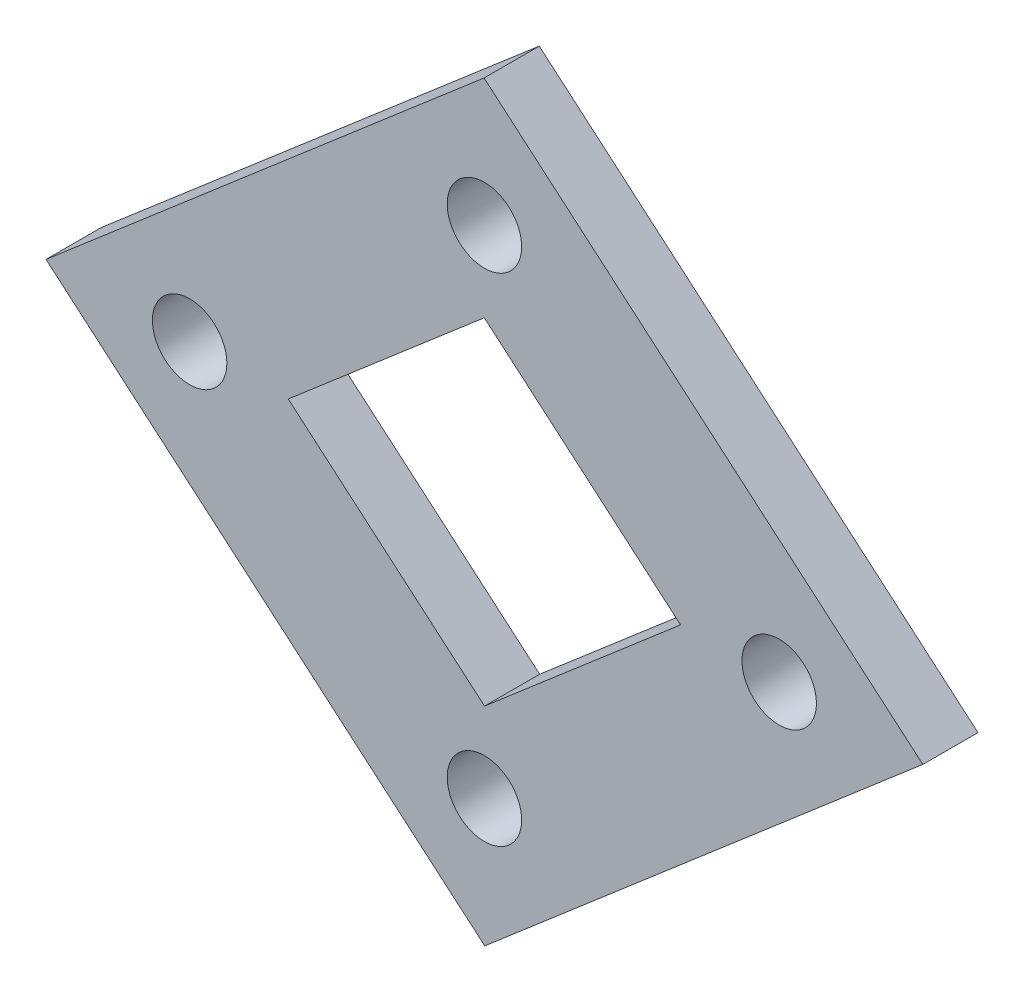
ISO-10303-21;
HEADER;
FILE_DESCRIPTION(('STEP AP214'),'2;1');
FILE_NAME('part.step','',(''),(''),'','','');
FILE_SCHEMA(('AUTOMOTIVE_DESIGN { 1 0 10303 214 1 1 1 1 }'));
ENDSEC;
DATA;
#1=APPLICATION_CONTEXT('core data for automotive mechanical design processes');
#2=APPLICATION_PROTOCOL_DEFINITION('international standard','automotive_design',2000,#1);
#3=PRODUCT_CONTEXT('',#1,'mechanical');
#4=PRODUCT('Part','Part','',(#3));
#5=PRODUCT_RELATED_PRODUCT_CATEGORY('part','',(#4));
#6=PRODUCT_DEFINITION_FORMATION('','',#4);
#7=PRODUCT_DEFINITION_CONTEXT('part definition',#1,'design');
#8=PRODUCT_DEFINITION('design','',#6,#7);
#9=PRODUCT_DEFINITION_SHAPE('','',#8);
#10=(LENGTH_UNIT() NAMED_UNIT(*) SI_UNIT(.MILLI.,.METRE.));
#11=(NAMED_UNIT(*) PLANE_ANGLE_UNIT() SI_UNIT($,.RADIAN.));
#12=(NAMED_UNIT(*) SI_UNIT($,.STERADIAN.) SOLID_ANGLE_UNIT());
#13=UNCERTAINTY_MEASURE_WITH_UNIT(LENGTH_MEASURE(1.E-05),#10,'distance_accuracy_value','');
#14=(GEOMETRIC_REPRESENTATION_CONTEXT(3) GLOBAL_UNCERTAINTY_ASSIGNED_CONTEXT((#13)) GLOBAL_UNIT_ASSIGNED_CONTEXT((#10,
#11,#12)) REPRESENTATION_CONTEXT('',''));
#15=CARTESIAN_POINT('',(0.,0.,0.));
#16=DIRECTION('',(0.,0.,1.));
#17=DIRECTION('',(1.,0.,0.));
#18=AXIS2_PLACEMENT_3D('',#15,#16,#17);
#19=CARTESIAN_POINT('',(-0.010881059290546,12.106513675807,1.778));
#20=DIRECTION('',(0.,0.,-1.));
#21=DIRECTION('',(-1.,0.,0.));
#22=AXIS2_PLACEMENT_3D('',#19,#20,#21);
#23=PLANE('',#22);
#24=DIRECTION('',(-0.758671381510446,-0.651473510495271,0.));
#25=VECTOR('',#24,1.);
#26=CARTESIAN_POINT('',(-0.0037231314855661,5.41674400301342,1.778));
#27=LINE('',#26,#25);
#28=CARTESIAN_POINT('',(-0.00372313148556654,5.41674400301342,1.778));
#29=VERTEX_POINT('',#28);
#30=CARTESIAN_POINT('',(-6.32172027620627,-0.00854009163069231,1.778));
#31=VERTEX_POINT('',#30);
#32=EDGE_CURVE('E117',#29,#31,#27,.T.);
#33=ORIENTED_EDGE('',*,*,#32,.F.);
#34=DIRECTION('',(-0.760063771593147,0.649848492428504,0.));
#35=VECTOR('',#34,1.);
#36=CARTESIAN_POINT('',(6.32172027620628,0.0085400916306967,1.778));
#37=LINE('',#36,#35);
#38=CARTESIAN_POINT('',(6.32172027620628,0.0085400916306967,1.778));
#39=VERTEX_POINT('',#38);
#40=EDGE_CURVE('E48',#39,#29,#37,.T.);
#41=ORIENTED_EDGE('',*,*,#40,.F.);
#42=DIRECTION('',(0.758671381510446,0.651473510495271,0.));
#43=VECTOR('',#42,1.);
#44=CARTESIAN_POINT('',(0.00372313148557427,-5.41674400301341,1.778));
#45=LINE('',#44,#43);
#46=CARTESIAN_POINT('',(0.00372313148557427,-5.41674400301341,1.778));
#47=VERTEX_POINT('',#46);
#48=EDGE_CURVE('E110',#47,#39,#45,.T.);
#49=ORIENTED_EDGE('',*,*,#48,.F.);
#50=DIRECTION('',(0.760063771593147,-0.649848492428504,0.));
#51=VECTOR('',#50,1.);
#52=CARTESIAN_POINT('',(-6.32172027620627,-0.00854009163069231,1.778));
#53=LINE('',#52,#51);
#54=EDGE_CURVE('E124',#31,#47,#53,.T.);
#55=ORIENTED_EDGE('',*,*,#54,.F.);
#56=EDGE_LOOP('',(#33,#41,#49,#55));
#57=FACE_BOUND('',#56,.T.);
#58=CARTESIAN_POINT('',(0.,-7.99999999999999,1.778));
#59=DIRECTION('',(0.,0.,1.));
#60=DIRECTION('',(1.,0.,0.));
#61=AXIS2_PLACEMENT_3D('',#58,#59,#60);
#62=CIRCLE('',#61,1.2);
#63=CARTESIAN_POINT('',(1.19999999999994,-7.99999999999999,1.778));
#64=VERTEX_POINT('',#63);
#65=EDGE_CURVE('E139',#64,#64,#62,.T.);
#66=ORIENTED_EDGE('',*,*,#65,.F.);
#67=EDGE_LOOP('',(#66));
#68=FACE_BOUND('',#67,.T.);
#69=CARTESIAN_POINT('',(0.,7.99999999999999,1.778));
#70=DIRECTION('',(0.,0.,1.));
#71=DIRECTION('',(1.,0.,0.));
#72=AXIS2_PLACEMENT_3D('',#69,#70,#71);
#73=CIRCLE('',#72,1.2);
#74=CARTESIAN_POINT('',(1.2,7.99999999999999,1.778));
#75=VERTEX_POINT('',#74);
#76=EDGE_CURVE('E151',#75,#75,#73,.T.);
#77=ORIENTED_EDGE('',*,*,#76,.F.);
#78=EDGE_LOOP('',(#77));
#79=FACE_BOUND('',#78,.T.);
#80=DIRECTION('',(-0.758671381510446,-0.651473510495271,0.));
#81=VECTOR('',#80,1.);
#82=CARTESIAN_POINT('',(-14.1291563645924,-0.0168939014920275,1.778));
#83=LINE('',#82,#81);
#84=CARTESIAN_POINT('',(-0.0108810592905463,12.106513675807,1.778));
#85=VERTEX_POINT('',#84);
#86=CARTESIAN_POINT('',(-14.1291563645924,-0.0168939014920275,1.778));
#87=VERTEX_POINT('',#86);
#88=EDGE_CURVE('E157',#85,#87,#83,.T.);
#89=ORIENTED_EDGE('',*,*,#88,.T.);
#90=DIRECTION('',(0.760063771593148,-0.649848492428504,0.));
#91=VECTOR('',#90,1.);
#92=CARTESIAN_POINT('',(-14.1291563645924,-0.0168939014920275,1.778));
#93=LINE('',#92,#91);
#94=CARTESIAN_POINT('',(0.0108810592905524,-12.106513675807,1.778));
#95=VERTEX_POINT('',#94);
#96=EDGE_CURVE('E160',#87,#95,#93,.T.);
#97=ORIENTED_EDGE('',*,*,#96,.T.);
#98=DIRECTION('',(0.758671381510446,0.651473510495271,0.));
#99=VECTOR('',#98,1.);
#100=CARTESIAN_POINT('',(0.0108810592905524,-12.106513675807,1.778));
#101=LINE('',#100,#99);
#102=CARTESIAN_POINT('',(14.1291563645924,0.0168939014920327,1.778));
#103=VERTEX_POINT('',#102);
#104=EDGE_CURVE('E163',#95,#103,#101,.T.);
#105=ORIENTED_EDGE('',*,*,#104,.T.);
#106=DIRECTION('',(-0.760063771593148,0.649848492428504,0.));
#107=VECTOR('',#106,1.);
#108=CARTESIAN_POINT('',(-0.0108810592905463,12.106513675807,1.778));
#109=LINE('',#108,#107);
#110=EDGE_CURVE('E165',#103,#85,#109,.T.);
#111=ORIENTED_EDGE('',*,*,#110,.T.);
#112=EDGE_LOOP('',(#89,#97,#105,#111));
#113=FACE_BOUND('',#112,.T.);
#114=CARTESIAN_POINT('',(-9.5,0.,1.778));
#115=DIRECTION('',(0.,0.,1.));
#116=DIRECTION('',(1.,0.,0.));
#117=AXIS2_PLACEMENT_3D('',#114,#115,#116);
#118=CIRCLE('',#117,1.2);
#119=CARTESIAN_POINT('',(-8.3,0.,1.778));
#120=VERTEX_POINT('',#119);
#121=EDGE_CURVE('E145',#120,#120,#118,.T.);
#122=ORIENTED_EDGE('',*,*,#121,.F.);
#123=EDGE_LOOP('',(#122));
#124=FACE_BOUND('',#123,.T.);
#125=CARTESIAN_POINT('',(9.5,0.,1.778));
#126=DIRECTION('',(0.,0.,1.));
#127=DIRECTION('',(1.,0.,0.));
#128=AXIS2_PLACEMENT_3D('',#125,#126,#127);
#129=CIRCLE('',#128,1.2);
#130=CARTESIAN_POINT('',(10.7,0.,1.778));
#131=VERTEX_POINT('',#130);
#132=EDGE_CURVE('E133',#131,#131,#129,.T.);
#133=ORIENTED_EDGE('',*,*,#132,.F.);
#134=EDGE_LOOP('',(#133));
#135=FACE_BOUND('',#134,.T.);
#136=ADVANCED_FACE('F33',(#57,#68,#79,#113,#124,#135),#23,.F.);
#137=CARTESIAN_POINT('',(-0.010881059290546,12.106513675807,0.));
#138=DIRECTION('',(0.,0.,-1.));
#139=DIRECTION('',(-1.,0.,0.));
#140=AXIS2_PLACEMENT_3D('',#137,#138,#139);
#141=PLANE('',#140);
#142=DIRECTION('',(-0.760063771593148,0.649848492428504,0.));
#143=VECTOR('',#142,1.);
#144=CARTESIAN_POINT('',(6.32172027620628,0.0085400916306967,0.));
#145=LINE('',#144,#143);
#146=CARTESIAN_POINT('',(6.32172027620628,0.00854009163069654,0.));
#147=VERTEX_POINT('',#146);
#148=CARTESIAN_POINT('',(-0.0037231314855661,5.41674400301342,0.));
#149=VERTEX_POINT('',#148);
#150=EDGE_CURVE('E108',#147,#149,#145,.T.);
#151=ORIENTED_EDGE('',*,*,#150,.T.);
#152=DIRECTION('',(-0.758671381510446,-0.651473510495271,0.));
#153=VECTOR('',#152,1.);
#154=CARTESIAN_POINT('',(-0.0037231314855661,5.41674400301342,0.));
#155=LINE('',#154,#153);
#156=CARTESIAN_POINT('',(-6.32172027620627,-0.00854009163069394,0.));
#157=VERTEX_POINT('',#156);
#158=EDGE_CURVE('E97',#149,#157,#155,.T.);
#159=ORIENTED_EDGE('',*,*,#158,.T.);
#160=DIRECTION('',(0.760063771593147,-0.649848492428504,0.));
#161=VECTOR('',#160,1.);
#162=CARTESIAN_POINT('',(-6.32172027620627,-0.00854009163069231,0.));
#163=LINE('',#162,#161);
#164=CARTESIAN_POINT('',(0.00372313148557478,-5.41674400301341,0.));
#165=VERTEX_POINT('',#164);
#166=EDGE_CURVE('E119',#157,#165,#163,.T.);
#167=ORIENTED_EDGE('',*,*,#166,.T.);
#168=DIRECTION('',(0.758671381510446,0.651473510495271,0.));
#169=VECTOR('',#168,1.);
#170=CARTESIAN_POINT('',(0.00372313148557427,-5.41674400301341,0.));
#171=LINE('',#170,#169);
#172=EDGE_CURVE('E115',#165,#147,#171,.T.);
#173=ORIENTED_EDGE('',*,*,#172,.T.);
#174=EDGE_LOOP('',(#151,#159,#167,#173));
#175=FACE_BOUND('',#174,.T.);
#176=CARTESIAN_POINT('',(0.,-7.99999999999999,0.));
#177=DIRECTION('',(0.,0.,1.));
#178=DIRECTION('',(1.,0.,0.));
#179=AXIS2_PLACEMENT_3D('',#176,#177,#178);
#180=CIRCLE('',#179,1.2);
#181=CARTESIAN_POINT('',(1.19999999999994,-7.99999999999999,0.));
#182=VERTEX_POINT('',#181);
#183=EDGE_CURVE('E136',#182,#182,#180,.T.);
#184=ORIENTED_EDGE('',*,*,#183,.T.);
#185=EDGE_LOOP('',(#184));
#186=FACE_BOUND('',#185,.T.);
#187=CARTESIAN_POINT('',(0.,7.99999999999999,0.));
#188=DIRECTION('',(0.,0.,1.));
#189=DIRECTION('',(1.,0.,0.));
#190=AXIS2_PLACEMENT_3D('',#187,#188,#189);
#191=CIRCLE('',#190,1.2);
#192=CARTESIAN_POINT('',(1.2,7.99999999999999,0.));
#193=VERTEX_POINT('',#192);
#194=EDGE_CURVE('E148',#193,#193,#191,.T.);
#195=ORIENTED_EDGE('',*,*,#194,.T.);
#196=EDGE_LOOP('',(#195));
#197=FACE_BOUND('',#196,.T.);
#198=DIRECTION('',(-0.758671381510446,-0.651473510495271,0.));
#199=VECTOR('',#198,1.);
#200=CARTESIAN_POINT('',(-14.1291563645924,-0.0168939014920275,0.));
#201=LINE('',#200,#199);
#202=CARTESIAN_POINT('',(-0.0108810592905463,12.106513675807,0.));
#203=VERTEX_POINT('',#202);
#204=CARTESIAN_POINT('',(-14.1291563645924,-0.0168939014920275,0.));
#205=VERTEX_POINT('',#204);
#206=EDGE_CURVE('E154',#203,#205,#201,.T.);
#207=ORIENTED_EDGE('',*,*,#206,.F.);
#208=DIRECTION('',(-0.760063771593148,0.649848492428504,0.));
#209=VECTOR('',#208,1.);
#210=CARTESIAN_POINT('',(-0.0108810592905463,12.106513675807,0.));
#211=LINE('',#210,#209);
#212=CARTESIAN_POINT('',(14.1291563645924,0.0168939014920327,0.));
#213=VERTEX_POINT('',#212);
#214=EDGE_CURVE('E161',#213,#203,#211,.T.);
#215=ORIENTED_EDGE('',*,*,#214,.F.);
#216=DIRECTION('',(0.758671381510446,0.651473510495271,0.));
#217=VECTOR('',#216,1.);
#218=CARTESIAN_POINT('',(0.0108810592905524,-12.106513675807,0.));
#219=LINE('',#218,#217);
#220=CARTESIAN_POINT('',(0.0108810592905524,-12.106513675807,0.));
#221=VERTEX_POINT('',#220);
#222=EDGE_CURVE('E172',#221,#213,#219,.T.);
#223=ORIENTED_EDGE('',*,*,#222,.F.);
#224=DIRECTION('',(0.760063771593148,-0.649848492428504,0.));
#225=VECTOR('',#224,1.);
#226=CARTESIAN_POINT('',(-14.1291563645924,-0.0168939014920275,0.));
#227=LINE('',#226,#225);
#228=EDGE_CURVE('E170',#205,#221,#227,.T.);
#229=ORIENTED_EDGE('',*,*,#228,.F.);
#230=EDGE_LOOP('',(#207,#215,#223,#229));
#231=FACE_BOUND('',#230,.T.);
#232=CARTESIAN_POINT('',(-9.5,0.,0.));
#233=DIRECTION('',(0.,0.,1.));
#234=DIRECTION('',(1.,0.,0.));
#235=AXIS2_PLACEMENT_3D('',#232,#233,#234);
#236=CIRCLE('',#235,1.2);
#237=CARTESIAN_POINT('',(-8.3,0.,0.));
#238=VERTEX_POINT('',#237);
#239=EDGE_CURVE('E142',#238,#238,#236,.T.);
#240=ORIENTED_EDGE('',*,*,#239,.T.);
#241=EDGE_LOOP('',(#240));
#242=FACE_BOUND('',#241,.T.);
#243=CARTESIAN_POINT('',(9.5,0.,0.));
#244=DIRECTION('',(0.,0.,1.));
#245=DIRECTION('',(1.,0.,0.));
#246=AXIS2_PLACEMENT_3D('',#243,#244,#245);
#247=CIRCLE('',#246,1.2);
#248=CARTESIAN_POINT('',(10.7,0.,0.));
#249=VERTEX_POINT('',#248);
#250=EDGE_CURVE('E104',#249,#249,#247,.T.);
#251=ORIENTED_EDGE('',*,*,#250,.T.);
#252=EDGE_LOOP('',(#251));
#253=FACE_BOUND('',#252,.T.);
#254=ADVANCED_FACE('F113',(#175,#186,#197,#231,#242,#253),#141,.T.);
#255=CARTESIAN_POINT('',(-14.1291563645924,-0.0168939014920275,1.778));
#256=DIRECTION('',(0.651473510495271,-0.758671381510446,0.));
#257=DIRECTION('',(0.758671381510446,0.651473510495271,0.));
#258=AXIS2_PLACEMENT_3D('',#255,#256,#257);
#259=PLANE('',#258);
#260=ORIENTED_EDGE('',*,*,#206,.T.);
#261=DIRECTION('',(0.,0.,-1.));
#262=VECTOR('',#261,1.);
#263=CARTESIAN_POINT('',(-14.1291563645924,-0.0168939014920275,1.778));
#264=LINE('',#263,#262);
#265=EDGE_CURVE('E11',#87,#205,#264,.T.);
#266=ORIENTED_EDGE('',*,*,#265,.F.);
#267=ORIENTED_EDGE('',*,*,#88,.F.);
#268=DIRECTION('',(0.,0.,-1.));
#269=VECTOR('',#268,1.);
#270=CARTESIAN_POINT('',(-0.0108810592905463,12.106513675807,1.778));
#271=LINE('',#270,#269);
#272=EDGE_CURVE('E167',#85,#203,#271,.T.);
#273=ORIENTED_EDGE('',*,*,#272,.T.);
#274=EDGE_LOOP('',(#260,#266,#267,#273));
#275=FACE_BOUND('',#274,.T.);
#276=ADVANCED_FACE('F35',(#275),#259,.F.);
#277=CARTESIAN_POINT('',(-14.1291563645924,-0.0168939014920275,1.778));
#278=DIRECTION('',(0.649848492428504,0.760063771593148,0.));
#279=DIRECTION('',(-0.760063771593148,0.649848492428504,0.));
#280=AXIS2_PLACEMENT_3D('',#277,#278,#279);
#281=PLANE('',#280);
#282=ORIENTED_EDGE('',*,*,#228,.T.);
#283=DIRECTION('',(0.,0.,-1.));
#284=VECTOR('',#283,1.);
#285=CARTESIAN_POINT('',(0.0108810592905524,-12.106513675807,1.778));
#286=LINE('',#285,#284);
#287=EDGE_CURVE('E41',#95,#221,#286,.T.);
#288=ORIENTED_EDGE('',*,*,#287,.F.);
#289=ORIENTED_EDGE('',*,*,#96,.F.);
#290=ORIENTED_EDGE('',*,*,#265,.T.);
#291=EDGE_LOOP('',(#282,#288,#289,#290));
#292=FACE_BOUND('',#291,.T.);
#293=ADVANCED_FACE('F200',(#292),#281,.F.);
#294=CARTESIAN_POINT('',(0.0108810592905524,-12.106513675807,1.778));
#295=DIRECTION('',(-0.651473510495271,0.758671381510446,0.));
#296=DIRECTION('',(-0.758671381510446,-0.651473510495271,0.));
#297=AXIS2_PLACEMENT_3D('',#294,#295,#296);
#298=PLANE('',#297);
#299=ORIENTED_EDGE('',*,*,#222,.T.);
#300=DIRECTION('',(0.,0.,-1.));
#301=VECTOR('',#300,1.);
#302=CARTESIAN_POINT('',(14.1291563645924,0.0168939014920327,1.778));
#303=LINE('',#302,#301);
#304=EDGE_CURVE('E177',#103,#213,#303,.T.);
#305=ORIENTED_EDGE('',*,*,#304,.F.);
#306=ORIENTED_EDGE('',*,*,#104,.F.);
#307=ORIENTED_EDGE('',*,*,#287,.T.);
#308=EDGE_LOOP('',(#299,#305,#306,#307));
#309=FACE_BOUND('',#308,.T.);
#310=ADVANCED_FACE('F184',(#309),#298,.F.);
#311=CARTESIAN_POINT('',(-0.0108810592905463,12.106513675807,1.778));
#312=DIRECTION('',(-0.649848492428504,-0.760063771593148,0.));
#313=DIRECTION('',(0.760063771593148,-0.649848492428504,0.));
#314=AXIS2_PLACEMENT_3D('',#311,#312,#313);
#315=PLANE('',#314);
#316=ORIENTED_EDGE('',*,*,#214,.T.);
#317=ORIENTED_EDGE('',*,*,#272,.F.);
#318=ORIENTED_EDGE('',*,*,#110,.F.);
#319=ORIENTED_EDGE('',*,*,#304,.T.);
#320=EDGE_LOOP('',(#316,#317,#318,#319));
#321=FACE_BOUND('',#320,.T.);
#322=ADVANCED_FACE('F193',(#321),#315,.F.);
#323=CARTESIAN_POINT('',(0.,7.99999999999999,1.778));
#324=DIRECTION('',(0.,0.,-1.));
#325=DIRECTION('',(-1.,0.,0.));
#326=AXIS2_PLACEMENT_3D('',#323,#324,#325);
#327=CYLINDRICAL_SURFACE('',#326,1.2);
#328=ORIENTED_EDGE('',*,*,#76,.T.);
#329=EDGE_LOOP('',(#328));
#330=FACE_BOUND('',#329,.T.);
#331=ORIENTED_EDGE('',*,*,#194,.F.);
#332=EDGE_LOOP('',(#331));
#333=FACE_BOUND('',#332,.T.);
#334=ADVANCED_FACE('F216',(#330,#333),#327,.F.);
#335=CARTESIAN_POINT('',(-9.5,0.,1.778));
#336=DIRECTION('',(0.,0.,-1.));
#337=DIRECTION('',(-1.,0.,0.));
#338=AXIS2_PLACEMENT_3D('',#335,#336,#337);
#339=CYLINDRICAL_SURFACE('',#338,1.2);
#340=ORIENTED_EDGE('',*,*,#121,.T.);
#341=EDGE_LOOP('',(#340));
#342=FACE_BOUND('',#341,.T.);
#343=ORIENTED_EDGE('',*,*,#239,.F.);
#344=EDGE_LOOP('',(#343));
#345=FACE_BOUND('',#344,.T.);
#346=ADVANCED_FACE('F223',(#342,#345),#339,.F.);
#347=CARTESIAN_POINT('',(0.,-7.99999999999999,1.778));
#348=DIRECTION('',(0.,0.,-1.));
#349=DIRECTION('',(-1.,0.,0.));
#350=AXIS2_PLACEMENT_3D('',#347,#348,#349);
#351=CYLINDRICAL_SURFACE('',#350,1.2);
#352=ORIENTED_EDGE('',*,*,#65,.T.);
#353=EDGE_LOOP('',(#352));
#354=FACE_BOUND('',#353,.T.);
#355=ORIENTED_EDGE('',*,*,#183,.F.);
#356=EDGE_LOOP('',(#355));
#357=FACE_BOUND('',#356,.T.);
#358=ADVANCED_FACE('F228',(#354,#357),#351,.F.);
#359=CARTESIAN_POINT('',(9.5,0.,1.778));
#360=DIRECTION('',(0.,0.,-1.));
#361=DIRECTION('',(-1.,0.,0.));
#362=AXIS2_PLACEMENT_3D('',#359,#360,#361);
#363=CYLINDRICAL_SURFACE('',#362,1.2);
#364=ORIENTED_EDGE('',*,*,#132,.T.);
#365=EDGE_LOOP('',(#364));
#366=FACE_BOUND('',#365,.T.);
#367=ORIENTED_EDGE('',*,*,#250,.F.);
#368=EDGE_LOOP('',(#367));
#369=FACE_BOUND('',#368,.T.);
#370=ADVANCED_FACE('F238',(#366,#369),#363,.F.);
#371=CARTESIAN_POINT('',(6.32172027620628,0.0085400916306967,-0.000999999999999916));
#372=DIRECTION('',(0.649848492428504,0.760063771593147,0.));
#373=DIRECTION('',(-0.760063771593148,0.649848492428504,0.));
#374=AXIS2_PLACEMENT_3D('',#371,#372,#373);
#375=PLANE('',#374);
#376=DIRECTION('',(0.,0.,1.));
#377=VECTOR('',#376,1.);
#378=CARTESIAN_POINT('',(6.32172027620628,0.0085400916306967,-0.000999999999999916));
#379=LINE('',#378,#377);
#380=EDGE_CURVE('E105',#147,#39,#379,.T.);
#381=ORIENTED_EDGE('',*,*,#380,.T.);
#382=ORIENTED_EDGE('',*,*,#40,.T.);
#383=DIRECTION('',(0.,0.,1.));
#384=VECTOR('',#383,1.);
#385=CARTESIAN_POINT('',(-0.0037231314855661,5.41674400301342,-0.000999999999999916));
#386=LINE('',#385,#384);
#387=EDGE_CURVE('E99',#149,#29,#386,.T.);
#388=ORIENTED_EDGE('',*,*,#387,.F.);
#389=ORIENTED_EDGE('',*,*,#150,.F.);
#390=EDGE_LOOP('',(#381,#382,#388,#389));
#391=FACE_BOUND('',#390,.T.);
#392=ADVANCED_FACE('F107',(#391),#375,.F.);
#393=CARTESIAN_POINT('',(0.00372313148557427,-5.41674400301341,-0.000999999999999916));
#394=DIRECTION('',(0.651473510495271,-0.758671381510446,0.));
#395=DIRECTION('',(0.758671381510446,0.651473510495271,0.));
#396=AXIS2_PLACEMENT_3D('',#393,#394,#395);
#397=PLANE('',#396);
#398=DIRECTION('',(0.,0.,1.));
#399=VECTOR('',#398,1.);
#400=CARTESIAN_POINT('',(0.00372313148557427,-5.41674400301341,-0.000999999999999916));
#401=LINE('',#400,#399);
#402=EDGE_CURVE('E130',#165,#47,#401,.T.);
#403=ORIENTED_EDGE('',*,*,#402,.T.);
#404=ORIENTED_EDGE('',*,*,#48,.T.);
#405=ORIENTED_EDGE('',*,*,#380,.F.);
#406=ORIENTED_EDGE('',*,*,#172,.F.);
#407=EDGE_LOOP('',(#403,#404,#405,#406));
#408=FACE_BOUND('',#407,.T.);
#409=ADVANCED_FACE('F248',(#408),#397,.F.);
#410=CARTESIAN_POINT('',(-6.32172027620627,-0.00854009163069231,-0.000999999999999916));
#411=DIRECTION('',(-0.649848492428504,-0.760063771593148,0.));
#412=DIRECTION('',(0.760063771593147,-0.649848492428504,0.));
#413=AXIS2_PLACEMENT_3D('',#410,#411,#412);
#414=PLANE('',#413);
#415=DIRECTION('',(0.,0.,1.));
#416=VECTOR('',#415,1.);
#417=CARTESIAN_POINT('',(-6.32172027620627,-0.00854009163069231,-0.000999999999999916));
#418=LINE('',#417,#416);
#419=EDGE_CURVE('E56',#157,#31,#418,.T.);
#420=ORIENTED_EDGE('',*,*,#419,.T.);
#421=ORIENTED_EDGE('',*,*,#54,.T.);
#422=ORIENTED_EDGE('',*,*,#402,.F.);
#423=ORIENTED_EDGE('',*,*,#166,.F.);
#424=EDGE_LOOP('',(#420,#421,#422,#423));
#425=FACE_BOUND('',#424,.T.);
#426=ADVANCED_FACE('F251',(#425),#414,.F.);
#427=CARTESIAN_POINT('',(-0.0037231314855661,5.41674400301342,-0.000999999999999916));
#428=DIRECTION('',(-0.651473510495271,0.758671381510445,0.));
#429=DIRECTION('',(-0.758671381510446,-0.651473510495271,0.));
#430=AXIS2_PLACEMENT_3D('',#427,#428,#429);
#431=PLANE('',#430);
#432=ORIENTED_EDGE('',*,*,#387,.T.);
#433=ORIENTED_EDGE('',*,*,#32,.T.);
#434=ORIENTED_EDGE('',*,*,#419,.F.);
#435=ORIENTED_EDGE('',*,*,#158,.F.);
#436=EDGE_LOOP('',(#432,#433,#434,#435));
#437=FACE_BOUND('',#436,.T.);
#438=ADVANCED_FACE('F98',(#437),#431,.F.);
#439=CLOSED_SHELL('',(#136,#254,#276,#293,#310,#322,#334,#346,#358,#370,#392,#409,#426,#438));
#440=MANIFOLD_SOLID_BREP('B2',#439);
#441=ADVANCED_BREP_SHAPE_REPRESENTATION('',(#18,#440),#14);
#442=SHAPE_DEFINITION_REPRESENTATION(#9,#441);
ENDSEC;
END-ISO-10303-21;
